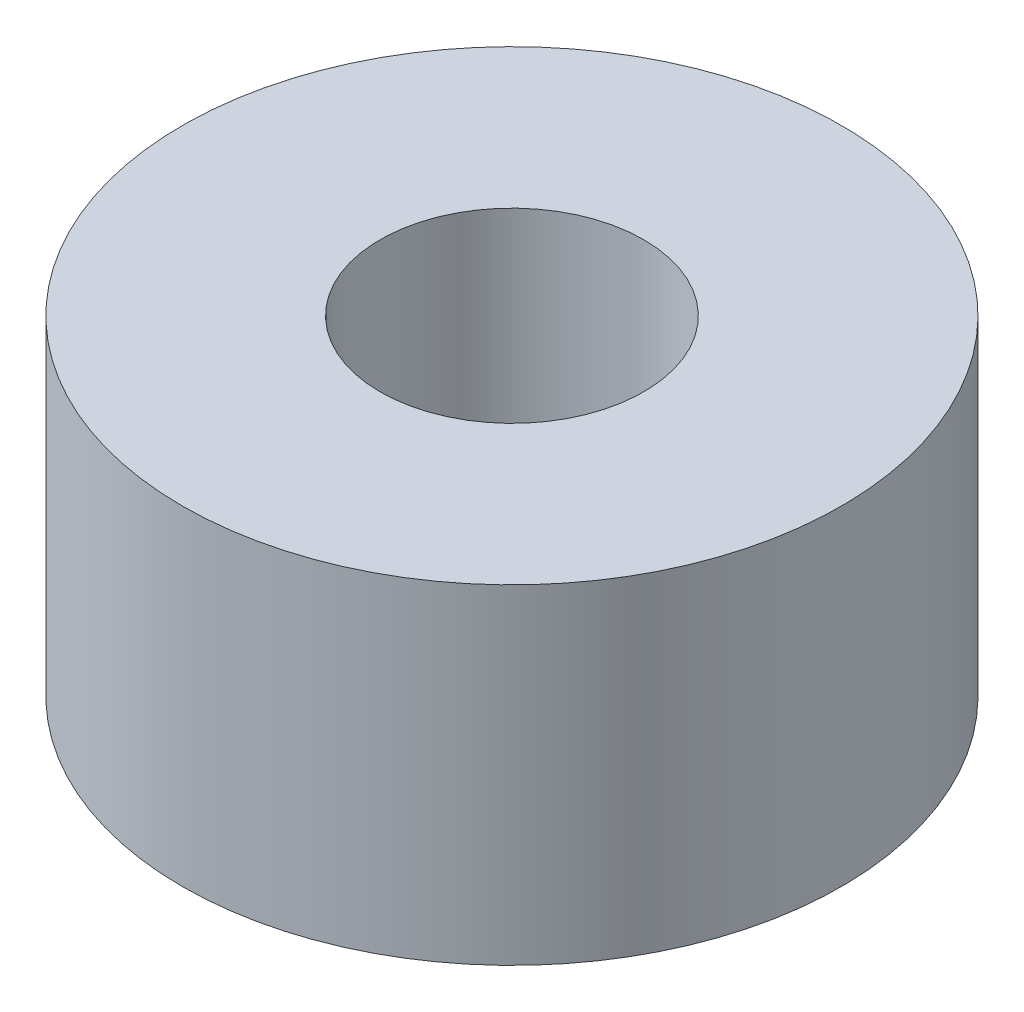
ISO-10303-21;
HEADER;
FILE_DESCRIPTION(('STEP AP214'),'2;1');
FILE_NAME('part.step','',(''),(''),'','','');
FILE_SCHEMA(('AUTOMOTIVE_DESIGN { 1 0 10303 214 1 1 1 1 }'));
ENDSEC;
DATA;
#1=APPLICATION_CONTEXT('core data for automotive mechanical design processes');
#2=APPLICATION_PROTOCOL_DEFINITION('international standard','automotive_design',2000,#1);
#3=PRODUCT_CONTEXT('',#1,'mechanical');
#4=PRODUCT('Part','Part','',(#3));
#5=PRODUCT_RELATED_PRODUCT_CATEGORY('part','',(#4));
#6=PRODUCT_DEFINITION_FORMATION('','',#4);
#7=PRODUCT_DEFINITION_CONTEXT('part definition',#1,'design');
#8=PRODUCT_DEFINITION('design','',#6,#7);
#9=PRODUCT_DEFINITION_SHAPE('','',#8);
#10=(LENGTH_UNIT() NAMED_UNIT(*) SI_UNIT(.MILLI.,.METRE.));
#11=(NAMED_UNIT(*) PLANE_ANGLE_UNIT() SI_UNIT($,.RADIAN.));
#12=(NAMED_UNIT(*) SI_UNIT($,.STERADIAN.) SOLID_ANGLE_UNIT());
#13=UNCERTAINTY_MEASURE_WITH_UNIT(LENGTH_MEASURE(1.E-05),#10,'distance_accuracy_value','');
#14=(GEOMETRIC_REPRESENTATION_CONTEXT(3) GLOBAL_UNCERTAINTY_ASSIGNED_CONTEXT((#13)) GLOBAL_UNIT_ASSIGNED_CONTEXT((#10,
#11,#12)) REPRESENTATION_CONTEXT('',''));
#15=CARTESIAN_POINT('',(0.,0.,0.));
#16=DIRECTION('',(0.,0.,1.));
#17=DIRECTION('',(1.,0.,0.));
#18=AXIS2_PLACEMENT_3D('',#15,#16,#17);
#19=CARTESIAN_POINT('',(0.,2.5,0.));
#20=DIRECTION('',(0.,1.,0.));
#21=DIRECTION('',(0.,0.,1.));
#22=AXIS2_PLACEMENT_3D('',#19,#20,#21);
#23=PLANE('',#22);
#24=CARTESIAN_POINT('',(0.,2.5,0.));
#25=DIRECTION('',(0.,1.,0.));
#26=DIRECTION('',(0.,0.,1.));
#27=AXIS2_PLACEMENT_3D('',#24,#25,#26);
#28=CIRCLE('',#27,2.5);
#29=CARTESIAN_POINT('',(0.,2.5,2.5));
#30=VERTEX_POINT('',#29);
#31=EDGE_CURVE('E10',#30,#30,#28,.T.);
#32=ORIENTED_EDGE('',*,*,#31,.T.);
#33=EDGE_LOOP('',(#32));
#34=FACE_BOUND('',#33,.T.);
#35=CARTESIAN_POINT('',(0.,2.5,0.));
#36=DIRECTION('',(0.,1.,0.));
#37=DIRECTION('',(0.,0.,1.));
#38=AXIS2_PLACEMENT_3D('',#35,#36,#37);
#39=CIRCLE('',#38,1.);
#40=CARTESIAN_POINT('',(0.,2.5,1.));
#41=VERTEX_POINT('',#40);
#42=EDGE_CURVE('E50',#41,#41,#39,.T.);
#43=ORIENTED_EDGE('',*,*,#42,.F.);
#44=EDGE_LOOP('',(#43));
#45=FACE_BOUND('',#44,.T.);
#46=ADVANCED_FACE('F37',(#34,#45),#23,.T.);
#47=CARTESIAN_POINT('',(0.,0.,0.));
#48=DIRECTION('',(0.,1.,0.));
#49=DIRECTION('',(0.,0.,1.));
#50=AXIS2_PLACEMENT_3D('',#47,#48,#49);
#51=PLANE('',#50);
#52=CARTESIAN_POINT('',(0.,0.,0.));
#53=DIRECTION('',(0.,1.,0.));
#54=DIRECTION('',(0.,0.,1.));
#55=AXIS2_PLACEMENT_3D('',#52,#53,#54);
#56=CIRCLE('',#55,2.5);
#57=CARTESIAN_POINT('',(0.,0.,2.5));
#58=VERTEX_POINT('',#57);
#59=EDGE_CURVE('E41',#58,#58,#56,.T.);
#60=ORIENTED_EDGE('',*,*,#59,.F.);
#61=EDGE_LOOP('',(#60));
#62=FACE_BOUND('',#61,.T.);
#63=CARTESIAN_POINT('',(0.,0.,0.));
#64=DIRECTION('',(0.,1.,0.));
#65=DIRECTION('',(0.,0.,1.));
#66=AXIS2_PLACEMENT_3D('',#63,#64,#65);
#67=CIRCLE('',#66,1.);
#68=CARTESIAN_POINT('',(0.,0.,1.));
#69=VERTEX_POINT('',#68);
#70=EDGE_CURVE('E52',#69,#69,#67,.T.);
#71=ORIENTED_EDGE('',*,*,#70,.T.);
#72=EDGE_LOOP('',(#71));
#73=FACE_BOUND('',#72,.T.);
#74=ADVANCED_FACE('F64',(#62,#73),#51,.F.);
#75=CARTESIAN_POINT('',(0.,2.5,0.));
#76=DIRECTION('',(0.,-1.,0.));
#77=DIRECTION('',(0.,0.,-1.));
#78=AXIS2_PLACEMENT_3D('',#75,#76,#77);
#79=CYLINDRICAL_SURFACE('',#78,2.5);
#80=ORIENTED_EDGE('',*,*,#31,.F.);
#81=EDGE_LOOP('',(#80));
#82=FACE_BOUND('',#81,.T.);
#83=ORIENTED_EDGE('',*,*,#59,.T.);
#84=EDGE_LOOP('',(#83));
#85=FACE_BOUND('',#84,.T.);
#86=ADVANCED_FACE('F39',(#82,#85),#79,.T.);
#87=CARTESIAN_POINT('',(0.,2.5,0.));
#88=DIRECTION('',(0.,-1.,0.));
#89=DIRECTION('',(0.,0.,-1.));
#90=AXIS2_PLACEMENT_3D('',#87,#88,#89);
#91=CYLINDRICAL_SURFACE('',#90,1.);
#92=ORIENTED_EDGE('',*,*,#42,.T.);
#93=EDGE_LOOP('',(#92));
#94=FACE_BOUND('',#93,.T.);
#95=ORIENTED_EDGE('',*,*,#70,.F.);
#96=EDGE_LOOP('',(#95));
#97=FACE_BOUND('',#96,.T.);
#98=ADVANCED_FACE('F60',(#94,#97),#91,.F.);
#99=CLOSED_SHELL('',(#46,#74,#86,#98));
#100=MANIFOLD_SOLID_BREP('B2',#99);
#101=ADVANCED_BREP_SHAPE_REPRESENTATION('',(#18,#100),#14);
#102=SHAPE_DEFINITION_REPRESENTATION(#9,#101);
ENDSEC;
END-ISO-10303-21;
